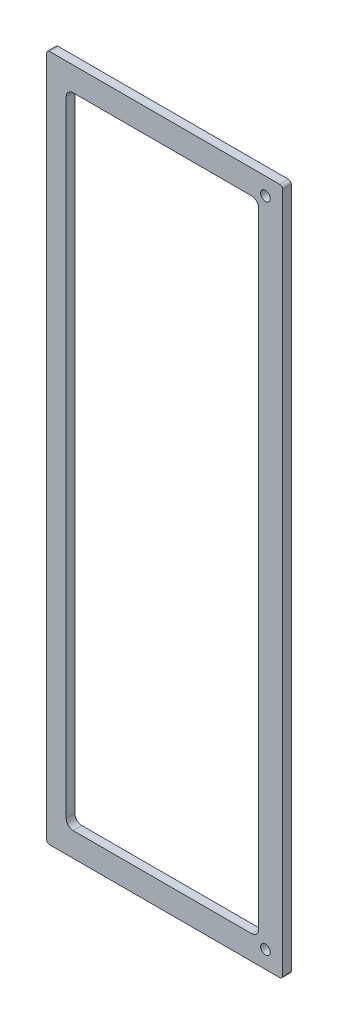
ISO-10303-21;
HEADER;
FILE_DESCRIPTION(('STEP AP214'),'2;1');
FILE_NAME('part.step','',(''),(''),'','','');
FILE_SCHEMA(('AUTOMOTIVE_DESIGN { 1 0 10303 214 1 1 1 1 }'));
ENDSEC;
DATA;
#1=APPLICATION_CONTEXT('core data for automotive mechanical design processes');
#2=APPLICATION_PROTOCOL_DEFINITION('international standard','automotive_design',2000,#1);
#3=PRODUCT_CONTEXT('',#1,'mechanical');
#4=PRODUCT('Part','Part','',(#3));
#5=PRODUCT_RELATED_PRODUCT_CATEGORY('part','',(#4));
#6=PRODUCT_DEFINITION_FORMATION('','',#4);
#7=PRODUCT_DEFINITION_CONTEXT('part definition',#1,'design');
#8=PRODUCT_DEFINITION('design','',#6,#7);
#9=PRODUCT_DEFINITION_SHAPE('','',#8);
#10=(LENGTH_UNIT() NAMED_UNIT(*) SI_UNIT(.MILLI.,.METRE.));
#11=(NAMED_UNIT(*) PLANE_ANGLE_UNIT() SI_UNIT($,.RADIAN.));
#12=(NAMED_UNIT(*) SI_UNIT($,.STERADIAN.) SOLID_ANGLE_UNIT());
#13=UNCERTAINTY_MEASURE_WITH_UNIT(LENGTH_MEASURE(1.E-05),#10,'distance_accuracy_value','');
#14=(GEOMETRIC_REPRESENTATION_CONTEXT(3) GLOBAL_UNCERTAINTY_ASSIGNED_CONTEXT((#13)) GLOBAL_UNIT_ASSIGNED_CONTEXT((#10,
#11,#12)) REPRESENTATION_CONTEXT('',''));
#15=CARTESIAN_POINT('',(0.,0.,0.));
#16=DIRECTION('',(0.,0.,1.));
#17=DIRECTION('',(1.,0.,0.));
#18=AXIS2_PLACEMENT_3D('',#15,#16,#17);
#19=CARTESIAN_POINT('',(0.,-12.5,6.35));
#20=DIRECTION('',(0.,-1.,0.));
#21=DIRECTION('',(0.,0.,-1.));
#22=AXIS2_PLACEMENT_3D('',#19,#20,#21);
#23=PLANE('',#22);
#24=DIRECTION('',(-1.,0.,0.));
#25=VECTOR('',#24,1.);
#26=CARTESIAN_POINT('',(0.,-12.5,0.));
#27=LINE('',#26,#25);
#28=CARTESIAN_POINT('',(10.37,-12.5,0.));
#29=VERTEX_POINT('',#28);
#30=CARTESIAN_POINT('',(-157.12,-12.5,0.));
#31=VERTEX_POINT('',#30);
#32=EDGE_CURVE('E200',#29,#31,#27,.T.);
#33=ORIENTED_EDGE('',*,*,#32,.F.);
#34=DIRECTION('',(0.,0.,-1.));
#35=VECTOR('',#34,1.);
#36=CARTESIAN_POINT('',(10.37,-12.5,6.35));
#37=LINE('',#36,#35);
#38=CARTESIAN_POINT('',(10.37,-12.5,6.35));
#39=VERTEX_POINT('',#38);
#40=EDGE_CURVE('E245',#29,#39,#37,.F.);
#41=ORIENTED_EDGE('',*,*,#40,.T.);
#42=DIRECTION('',(-1.,0.,0.));
#43=VECTOR('',#42,1.);
#44=CARTESIAN_POINT('',(0.,-12.5,6.35));
#45=LINE('',#44,#43);
#46=CARTESIAN_POINT('',(-157.12,-12.5,6.35));
#47=VERTEX_POINT('',#46);
#48=EDGE_CURVE('E206',#39,#47,#45,.T.);
#49=ORIENTED_EDGE('',*,*,#48,.T.);
#50=DIRECTION('',(0.,0.,1.));
#51=VECTOR('',#50,1.);
#52=CARTESIAN_POINT('',(-157.12,-12.5,0.));
#53=LINE('',#52,#51);
#54=EDGE_CURVE('E242',#47,#31,#53,.F.);
#55=ORIENTED_EDGE('',*,*,#54,.T.);
#56=EDGE_LOOP('',(#33,#41,#49,#55));
#57=FACE_BOUND('',#56,.T.);
#58=ADVANCED_FACE('F46',(#57),#23,.T.);
#59=CARTESIAN_POINT('',(12.5,0.,6.35));
#60=DIRECTION('',(-1.,0.,0.));
#61=DIRECTION('',(0.,0.,1.));
#62=AXIS2_PLACEMENT_3D('',#59,#60,#61);
#63=PLANE('',#62);
#64=DIRECTION('',(0.,1.,0.));
#65=VECTOR('',#64,1.);
#66=CARTESIAN_POINT('',(12.5,0.,0.));
#67=LINE('',#66,#65);
#68=CARTESIAN_POINT('',(12.5,-10.37,0.));
#69=VERTEX_POINT('',#68);
#70=CARTESIAN_POINT('',(12.5,485.37,0.));
#71=VERTEX_POINT('',#70);
#72=EDGE_CURVE('E193',#69,#71,#67,.T.);
#73=ORIENTED_EDGE('',*,*,#72,.T.);
#74=DIRECTION('',(0.,0.,-1.));
#75=VECTOR('',#74,1.);
#76=CARTESIAN_POINT('',(12.5,485.37,6.35));
#77=LINE('',#76,#75);
#78=CARTESIAN_POINT('',(12.5,485.37,6.35));
#79=VERTEX_POINT('',#78);
#80=EDGE_CURVE('E165',#71,#79,#77,.F.);
#81=ORIENTED_EDGE('',*,*,#80,.T.);
#82=DIRECTION('',(0.,1.,0.));
#83=VECTOR('',#82,1.);
#84=CARTESIAN_POINT('',(12.5,0.,6.35));
#85=LINE('',#84,#83);
#86=CARTESIAN_POINT('',(12.5,-10.37,6.35));
#87=VERTEX_POINT('',#86);
#88=EDGE_CURVE('E342',#87,#79,#85,.T.);
#89=ORIENTED_EDGE('',*,*,#88,.F.);
#90=DIRECTION('',(0.,0.,-1.));
#91=VECTOR('',#90,1.);
#92=CARTESIAN_POINT('',(12.5,-10.37,0.));
#93=LINE('',#92,#91);
#94=EDGE_CURVE('E236',#87,#69,#93,.T.);
#95=ORIENTED_EDGE('',*,*,#94,.T.);
#96=EDGE_LOOP('',(#73,#81,#89,#95));
#97=FACE_BOUND('',#96,.T.);
#98=ADVANCED_FACE('F382',(#97),#63,.F.);
#99=CARTESIAN_POINT('',(0.,475.,6.35));
#100=DIRECTION('',(0.,0.,-1.));
#101=DIRECTION('',(-1.,0.,0.));
#102=AXIS2_PLACEMENT_3D('',#99,#100,#101);
#103=CYLINDRICAL_SURFACE('',#102,3.50000000000002);
#104=CARTESIAN_POINT('',(0.,475.,6.35));
#105=DIRECTION('',(0.,0.,1.));
#106=DIRECTION('',(1.,0.,0.));
#107=AXIS2_PLACEMENT_3D('',#104,#105,#106);
#108=CIRCLE('',#107,3.50000000000002);
#109=CARTESIAN_POINT('',(3.50000000000001,475.,6.35));
#110=VERTEX_POINT('',#109);
#111=EDGE_CURVE('E348',#110,#110,#108,.T.);
#112=ORIENTED_EDGE('',*,*,#111,.T.);
#113=EDGE_LOOP('',(#112));
#114=FACE_BOUND('',#113,.T.);
#115=CARTESIAN_POINT('',(0.,475.,0.));
#116=DIRECTION('',(0.,0.,1.));
#117=DIRECTION('',(1.,0.,0.));
#118=AXIS2_PLACEMENT_3D('',#115,#116,#117);
#119=CIRCLE('',#118,3.50000000000002);
#120=CARTESIAN_POINT('',(3.50000000000001,475.,0.));
#121=VERTEX_POINT('',#120);
#122=EDGE_CURVE('E192',#121,#121,#119,.T.);
#123=ORIENTED_EDGE('',*,*,#122,.F.);
#124=EDGE_LOOP('',(#123));
#125=FACE_BOUND('',#124,.T.);
#126=ADVANCED_FACE('F391',(#114,#125),#103,.F.);
#127=CARTESIAN_POINT('',(0.,487.5,6.35));
#128=DIRECTION('',(0.,-1.,0.));
#129=DIRECTION('',(0.,0.,-1.));
#130=AXIS2_PLACEMENT_3D('',#127,#128,#129);
#131=PLANE('',#130);
#132=DIRECTION('',(-1.,0.,0.));
#133=VECTOR('',#132,1.);
#134=CARTESIAN_POINT('',(0.,487.5,0.));
#135=LINE('',#134,#133);
#136=CARTESIAN_POINT('',(10.37,487.5,0.));
#137=VERTEX_POINT('',#136);
#138=CARTESIAN_POINT('',(-157.12,487.5,0.));
#139=VERTEX_POINT('',#138);
#140=EDGE_CURVE('E179',#137,#139,#135,.T.);
#141=ORIENTED_EDGE('',*,*,#140,.T.);
#142=DIRECTION('',(0.,0.,1.));
#143=VECTOR('',#142,1.);
#144=CARTESIAN_POINT('',(-157.12,487.5,6.35));
#145=LINE('',#144,#143);
#146=CARTESIAN_POINT('',(-157.12,487.5,6.35));
#147=VERTEX_POINT('',#146);
#148=EDGE_CURVE('E184',#139,#147,#145,.T.);
#149=ORIENTED_EDGE('',*,*,#148,.T.);
#150=DIRECTION('',(-1.,0.,0.));
#151=VECTOR('',#150,1.);
#152=CARTESIAN_POINT('',(0.,487.5,6.35));
#153=LINE('',#152,#151);
#154=CARTESIAN_POINT('',(10.37,487.5,6.35));
#155=VERTEX_POINT('',#154);
#156=EDGE_CURVE('E182',#155,#147,#153,.T.);
#157=ORIENTED_EDGE('',*,*,#156,.F.);
#158=DIRECTION('',(0.,0.,-1.));
#159=VECTOR('',#158,1.);
#160=CARTESIAN_POINT('',(10.37,487.5,6.35));
#161=LINE('',#160,#159);
#162=EDGE_CURVE('E164',#155,#137,#161,.T.);
#163=ORIENTED_EDGE('',*,*,#162,.T.);
#164=EDGE_LOOP('',(#141,#149,#157,#163));
#165=FACE_BOUND('',#164,.T.);
#166=ADVANCED_FACE('F177',(#165),#131,.F.);
#167=CARTESIAN_POINT('',(0.,0.,6.35));
#168=DIRECTION('',(0.,0.,-1.));
#169=DIRECTION('',(-1.,0.,0.));
#170=AXIS2_PLACEMENT_3D('',#167,#168,#169);
#171=CYLINDRICAL_SURFACE('',#170,3.5);
#172=CARTESIAN_POINT('',(0.,0.,6.35));
#173=DIRECTION('',(0.,0.,1.));
#174=DIRECTION('',(1.,0.,0.));
#175=AXIS2_PLACEMENT_3D('',#172,#173,#174);
#176=CIRCLE('',#175,3.5);
#177=CARTESIAN_POINT('',(3.5,0.,6.35));
#178=VERTEX_POINT('',#177);
#179=EDGE_CURVE('E185',#178,#178,#176,.T.);
#180=ORIENTED_EDGE('',*,*,#179,.T.);
#181=EDGE_LOOP('',(#180));
#182=FACE_BOUND('',#181,.T.);
#183=CARTESIAN_POINT('',(0.,0.,0.));
#184=DIRECTION('',(0.,0.,1.));
#185=DIRECTION('',(1.,0.,0.));
#186=AXIS2_PLACEMENT_3D('',#183,#184,#185);
#187=CIRCLE('',#186,3.5);
#188=CARTESIAN_POINT('',(3.5,0.,0.));
#189=VERTEX_POINT('',#188);
#190=EDGE_CURVE('E198',#189,#189,#187,.T.);
#191=ORIENTED_EDGE('',*,*,#190,.F.);
#192=EDGE_LOOP('',(#191));
#193=FACE_BOUND('',#192,.T.);
#194=ADVANCED_FACE('F444',(#182,#193),#171,.F.);
#195=CARTESIAN_POINT('',(0.,0.,6.35));
#196=DIRECTION('',(0.,0.,1.));
#197=DIRECTION('',(1.,0.,0.));
#198=AXIS2_PLACEMENT_3D('',#195,#196,#197);
#199=PLANE('',#198);
#200=ORIENTED_EDGE('',*,*,#156,.T.);
#201=CARTESIAN_POINT('',(-157.12,485.37,6.35));
#202=DIRECTION('',(0.,0.,1.));
#203=DIRECTION('',(1.,0.,0.));
#204=AXIS2_PLACEMENT_3D('',#201,#202,#203);
#205=CIRCLE('',#204,2.13);
#206=CARTESIAN_POINT('',(-159.25,485.37,6.35));
#207=VERTEX_POINT('',#206);
#208=EDGE_CURVE('E219',#147,#207,#205,.T.);
#209=ORIENTED_EDGE('',*,*,#208,.T.);
#210=DIRECTION('',(0.,1.,0.));
#211=VECTOR('',#210,1.);
#212=CARTESIAN_POINT('',(-159.25,487.5,6.35));
#213=LINE('',#212,#211);
#214=CARTESIAN_POINT('',(-159.25,-10.37,6.35));
#215=VERTEX_POINT('',#214);
#216=EDGE_CURVE('E369',#215,#207,#213,.T.);
#217=ORIENTED_EDGE('',*,*,#216,.F.);
#218=CARTESIAN_POINT('',(-157.12,-10.37,6.35));
#219=DIRECTION('',(0.,0.,1.));
#220=DIRECTION('',(1.,0.,0.));
#221=AXIS2_PLACEMENT_3D('',#218,#219,#220);
#222=CIRCLE('',#221,2.13);
#223=EDGE_CURVE('E210',#215,#47,#222,.T.);
#224=ORIENTED_EDGE('',*,*,#223,.T.);
#225=ORIENTED_EDGE('',*,*,#48,.F.);
#226=CARTESIAN_POINT('',(10.37,-10.37,6.35));
#227=DIRECTION('',(0.,0.,1.));
#228=DIRECTION('',(1.,0.,0.));
#229=AXIS2_PLACEMENT_3D('',#226,#227,#228);
#230=CIRCLE('',#229,2.13);
#231=EDGE_CURVE('E213',#39,#87,#230,.T.);
#232=ORIENTED_EDGE('',*,*,#231,.T.);
#233=ORIENTED_EDGE('',*,*,#88,.T.);
#234=CARTESIAN_POINT('',(10.37,485.37,6.35));
#235=DIRECTION('',(0.,0.,1.));
#236=DIRECTION('',(1.,0.,0.));
#237=AXIS2_PLACEMENT_3D('',#234,#235,#236);
#238=CIRCLE('',#237,2.13);
#239=EDGE_CURVE('E216',#79,#155,#238,.T.);
#240=ORIENTED_EDGE('',*,*,#239,.T.);
#241=EDGE_LOOP('',(#200,#209,#217,#224,#225,#232,#233,#240));
#242=FACE_BOUND('',#241,.T.);
#243=DIRECTION('',(0.,1.,0.));
#244=VECTOR('',#243,1.);
#245=CARTESIAN_POINT('',(-4.99999975971581,470.000000240284,6.35));
#246=LINE('',#245,#244);
#247=CARTESIAN_POINT('',(-4.99999975971581,9.99999975971583,6.35));
#248=VERTEX_POINT('',#247);
#249=CARTESIAN_POINT('',(-4.99999975971581,465.000000240284,6.35));
#250=VERTEX_POINT('',#249);
#251=EDGE_CURVE('E299',#248,#250,#246,.T.);
#252=ORIENTED_EDGE('',*,*,#251,.F.);
#253=CARTESIAN_POINT('',(-9.99999975971581,9.99999975971583,6.35));
#254=DIRECTION('',(0.,0.,1.));
#255=DIRECTION('',(1.,0.,0.));
#256=AXIS2_PLACEMENT_3D('',#253,#254,#255);
#257=CIRCLE('',#256,5.);
#258=CARTESIAN_POINT('',(-9.9999997597158,4.99999975971581,6.35));
#259=VERTEX_POINT('',#258);
#260=EDGE_CURVE('E275',#248,#259,#257,.F.);
#261=ORIENTED_EDGE('',*,*,#260,.T.);
#262=DIRECTION('',(1.,0.,0.));
#263=VECTOR('',#262,1.);
#264=CARTESIAN_POINT('',(-145.000000240284,4.99999975971581,6.35));
#265=LINE('',#264,#263);
#266=CARTESIAN_POINT('',(-140.000000240284,4.99999975971581,6.35));
#267=VERTEX_POINT('',#266);
#268=EDGE_CURVE('E323',#267,#259,#265,.T.);
#269=ORIENTED_EDGE('',*,*,#268,.F.);
#270=CARTESIAN_POINT('',(-140.000000240284,9.99999975971581,6.35));
#271=DIRECTION('',(0.,0.,1.));
#272=DIRECTION('',(1.,0.,0.));
#273=AXIS2_PLACEMENT_3D('',#270,#271,#272);
#274=CIRCLE('',#273,5.);
#275=CARTESIAN_POINT('',(-145.000000240284,9.99999975971583,6.35));
#276=VERTEX_POINT('',#275);
#277=EDGE_CURVE('E281',#267,#276,#274,.F.);
#278=ORIENTED_EDGE('',*,*,#277,.T.);
#279=DIRECTION('',(0.,-1.,0.));
#280=VECTOR('',#279,1.);
#281=CARTESIAN_POINT('',(-145.000000240284,470.000000240284,6.35));
#282=LINE('',#281,#280);
#283=CARTESIAN_POINT('',(-145.000000240284,465.000000240284,6.35));
#284=VERTEX_POINT('',#283);
#285=EDGE_CURVE('E332',#284,#276,#282,.T.);
#286=ORIENTED_EDGE('',*,*,#285,.F.);
#287=CARTESIAN_POINT('',(-140.000000240284,465.000000240284,6.35));
#288=DIRECTION('',(0.,0.,1.));
#289=DIRECTION('',(1.,0.,0.));
#290=AXIS2_PLACEMENT_3D('',#287,#288,#289);
#291=CIRCLE('',#290,5.);
#292=CARTESIAN_POINT('',(-140.000000240284,470.000000240284,6.35));
#293=VERTEX_POINT('',#292);
#294=EDGE_CURVE('E287',#284,#293,#291,.F.);
#295=ORIENTED_EDGE('',*,*,#294,.T.);
#296=DIRECTION('',(-1.,0.,0.));
#297=VECTOR('',#296,1.);
#298=CARTESIAN_POINT('',(-145.000000240284,470.000000240284,6.35));
#299=LINE('',#298,#297);
#300=CARTESIAN_POINT('',(-9.9999997597158,470.000000240284,6.35));
#301=VERTEX_POINT('',#300);
#302=EDGE_CURVE('E300',#301,#293,#299,.T.);
#303=ORIENTED_EDGE('',*,*,#302,.F.);
#304=CARTESIAN_POINT('',(-9.9999997597158,465.000000240284,6.35));
#305=DIRECTION('',(0.,0.,1.));
#306=DIRECTION('',(1.,0.,0.));
#307=AXIS2_PLACEMENT_3D('',#304,#305,#306);
#308=CIRCLE('',#307,5.);
#309=EDGE_CURVE('E55',#301,#250,#308,.F.);
#310=ORIENTED_EDGE('',*,*,#309,.T.);
#311=EDGE_LOOP('',(#252,#261,#269,#278,#286,#295,#303,#310));
#312=FACE_BOUND('',#311,.T.);
#313=ORIENTED_EDGE('',*,*,#111,.F.);
#314=EDGE_LOOP('',(#313));
#315=FACE_BOUND('',#314,.T.);
#316=ORIENTED_EDGE('',*,*,#179,.F.);
#317=EDGE_LOOP('',(#316));
#318=FACE_BOUND('',#317,.T.);
#319=ADVANCED_FACE('F297',(#242,#312,#315,#318),#199,.T.);
#320=CARTESIAN_POINT('',(0.,0.,0.));
#321=DIRECTION('',(0.,0.,1.));
#322=DIRECTION('',(1.,0.,0.));
#323=AXIS2_PLACEMENT_3D('',#320,#321,#322);
#324=PLANE('',#323);
#325=DIRECTION('',(0.,-1.,0.));
#326=VECTOR('',#325,1.);
#327=CARTESIAN_POINT('',(-145.000000240284,470.000000240284,0.));
#328=LINE('',#327,#326);
#329=CARTESIAN_POINT('',(-145.000000240284,465.000000240284,0.));
#330=VERTEX_POINT('',#329);
#331=CARTESIAN_POINT('',(-145.000000240284,9.99999975971583,0.));
#332=VERTEX_POINT('',#331);
#333=EDGE_CURVE('E315',#330,#332,#328,.T.);
#334=ORIENTED_EDGE('',*,*,#333,.T.);
#335=CARTESIAN_POINT('',(-140.000000240284,9.99999975971581,0.));
#336=DIRECTION('',(0.,0.,1.));
#337=DIRECTION('',(1.,0.,0.));
#338=AXIS2_PLACEMENT_3D('',#335,#336,#337);
#339=CIRCLE('',#338,5.);
#340=CARTESIAN_POINT('',(-140.000000240284,4.99999975971581,0.));
#341=VERTEX_POINT('',#340);
#342=EDGE_CURVE('E284',#332,#341,#339,.T.);
#343=ORIENTED_EDGE('',*,*,#342,.T.);
#344=DIRECTION('',(1.,0.,0.));
#345=VECTOR('',#344,1.);
#346=CARTESIAN_POINT('',(-145.000000240284,4.99999975971581,0.));
#347=LINE('',#346,#345);
#348=CARTESIAN_POINT('',(-9.9999997597158,4.99999975971581,0.));
#349=VERTEX_POINT('',#348);
#350=EDGE_CURVE('E321',#341,#349,#347,.T.);
#351=ORIENTED_EDGE('',*,*,#350,.T.);
#352=CARTESIAN_POINT('',(-9.99999975971581,9.99999975971583,0.));
#353=DIRECTION('',(0.,0.,1.));
#354=DIRECTION('',(1.,0.,0.));
#355=AXIS2_PLACEMENT_3D('',#352,#353,#354);
#356=CIRCLE('',#355,5.);
#357=CARTESIAN_POINT('',(-4.99999975971581,9.99999975971583,0.));
#358=VERTEX_POINT('',#357);
#359=EDGE_CURVE('E278',#349,#358,#356,.T.);
#360=ORIENTED_EDGE('',*,*,#359,.T.);
#361=DIRECTION('',(0.,1.,0.));
#362=VECTOR('',#361,1.);
#363=CARTESIAN_POINT('',(-4.99999975971581,470.000000240284,0.));
#364=LINE('',#363,#362);
#365=CARTESIAN_POINT('',(-4.99999975971581,465.000000240284,0.));
#366=VERTEX_POINT('',#365);
#367=EDGE_CURVE('E316',#358,#366,#364,.T.);
#368=ORIENTED_EDGE('',*,*,#367,.T.);
#369=CARTESIAN_POINT('',(-9.9999997597158,465.000000240284,0.));
#370=DIRECTION('',(0.,0.,1.));
#371=DIRECTION('',(1.,0.,0.));
#372=AXIS2_PLACEMENT_3D('',#369,#370,#371);
#373=CIRCLE('',#372,5.);
#374=CARTESIAN_POINT('',(-9.9999997597158,470.000000240284,0.));
#375=VERTEX_POINT('',#374);
#376=EDGE_CURVE('E11',#366,#375,#373,.T.);
#377=ORIENTED_EDGE('',*,*,#376,.T.);
#378=DIRECTION('',(-1.,0.,0.));
#379=VECTOR('',#378,1.);
#380=CARTESIAN_POINT('',(-145.000000240284,470.000000240284,0.));
#381=LINE('',#380,#379);
#382=CARTESIAN_POINT('',(-140.000000240284,470.000000240284,0.));
#383=VERTEX_POINT('',#382);
#384=EDGE_CURVE('E312',#375,#383,#381,.T.);
#385=ORIENTED_EDGE('',*,*,#384,.T.);
#386=CARTESIAN_POINT('',(-140.000000240284,465.000000240284,0.));
#387=DIRECTION('',(0.,0.,1.));
#388=DIRECTION('',(1.,0.,0.));
#389=AXIS2_PLACEMENT_3D('',#386,#387,#388);
#390=CIRCLE('',#389,5.);
#391=EDGE_CURVE('E290',#383,#330,#390,.T.);
#392=ORIENTED_EDGE('',*,*,#391,.T.);
#393=EDGE_LOOP('',(#334,#343,#351,#360,#368,#377,#385,#392));
#394=FACE_BOUND('',#393,.T.);
#395=DIRECTION('',(0.,1.,0.));
#396=VECTOR('',#395,1.);
#397=CARTESIAN_POINT('',(-159.25,487.5,0.));
#398=LINE('',#397,#396);
#399=CARTESIAN_POINT('',(-159.25,-10.37,0.));
#400=VERTEX_POINT('',#399);
#401=CARTESIAN_POINT('',(-159.25,485.37,0.));
#402=VERTEX_POINT('',#401);
#403=EDGE_CURVE('E309',#400,#402,#398,.T.);
#404=ORIENTED_EDGE('',*,*,#403,.T.);
#405=CARTESIAN_POINT('',(-157.12,485.37,0.));
#406=DIRECTION('',(0.,0.,1.));
#407=DIRECTION('',(1.,0.,0.));
#408=AXIS2_PLACEMENT_3D('',#405,#406,#407);
#409=CIRCLE('',#408,2.13);
#410=EDGE_CURVE('E171',#402,#139,#409,.F.);
#411=ORIENTED_EDGE('',*,*,#410,.T.);
#412=ORIENTED_EDGE('',*,*,#140,.F.);
#413=CARTESIAN_POINT('',(10.37,485.37,0.));
#414=DIRECTION('',(0.,0.,1.));
#415=DIRECTION('',(1.,0.,0.));
#416=AXIS2_PLACEMENT_3D('',#413,#414,#415);
#417=CIRCLE('',#416,2.13);
#418=EDGE_CURVE('E160',#137,#71,#417,.F.);
#419=ORIENTED_EDGE('',*,*,#418,.T.);
#420=ORIENTED_EDGE('',*,*,#72,.F.);
#421=CARTESIAN_POINT('',(10.37,-10.37,0.));
#422=DIRECTION('',(0.,0.,1.));
#423=DIRECTION('',(1.,0.,0.));
#424=AXIS2_PLACEMENT_3D('',#421,#422,#423);
#425=CIRCLE('',#424,2.13);
#426=EDGE_CURVE('E172',#69,#29,#425,.F.);
#427=ORIENTED_EDGE('',*,*,#426,.T.);
#428=ORIENTED_EDGE('',*,*,#32,.T.);
#429=CARTESIAN_POINT('',(-157.12,-10.37,0.));
#430=DIRECTION('',(0.,0.,1.));
#431=DIRECTION('',(1.,0.,0.));
#432=AXIS2_PLACEMENT_3D('',#429,#430,#431);
#433=CIRCLE('',#432,2.13);
#434=EDGE_CURVE('E229',#31,#400,#433,.F.);
#435=ORIENTED_EDGE('',*,*,#434,.T.);
#436=EDGE_LOOP('',(#404,#411,#412,#419,#420,#427,#428,#435));
#437=FACE_BOUND('',#436,.T.);
#438=ORIENTED_EDGE('',*,*,#122,.T.);
#439=EDGE_LOOP('',(#438));
#440=FACE_BOUND('',#439,.T.);
#441=ORIENTED_EDGE('',*,*,#190,.T.);
#442=EDGE_LOOP('',(#441));
#443=FACE_BOUND('',#442,.T.);
#444=ADVANCED_FACE('F188',(#394,#437,#440,#443),#324,.F.);
#445=CARTESIAN_POINT('',(-4.99999975971581,470.000000240284,0.));
#446=DIRECTION('',(1.,0.,0.));
#447=DIRECTION('',(0.,0.,-1.));
#448=AXIS2_PLACEMENT_3D('',#445,#446,#447);
#449=PLANE('',#448);
#450=ORIENTED_EDGE('',*,*,#367,.F.);
#451=DIRECTION('',(0.,0.,1.));
#452=VECTOR('',#451,1.);
#453=CARTESIAN_POINT('',(-4.99999975971581,9.99999975971583,6.35));
#454=LINE('',#453,#452);
#455=EDGE_CURVE('E251',#358,#248,#454,.T.);
#456=ORIENTED_EDGE('',*,*,#455,.T.);
#457=ORIENTED_EDGE('',*,*,#251,.T.);
#458=DIRECTION('',(0.,0.,1.));
#459=VECTOR('',#458,1.);
#460=CARTESIAN_POINT('',(-4.99999975971581,465.000000240284,0.));
#461=LINE('',#460,#459);
#462=EDGE_CURVE('E248',#250,#366,#461,.F.);
#463=ORIENTED_EDGE('',*,*,#462,.T.);
#464=EDGE_LOOP('',(#450,#456,#457,#463));
#465=FACE_BOUND('',#464,.T.);
#466=ADVANCED_FACE('F306',(#465),#449,.F.);
#467=CARTESIAN_POINT('',(-145.000000240284,4.99999975971581,0.));
#468=DIRECTION('',(0.,-1.,0.));
#469=DIRECTION('',(0.,0.,-1.));
#470=AXIS2_PLACEMENT_3D('',#467,#468,#469);
#471=PLANE('',#470);
#472=ORIENTED_EDGE('',*,*,#268,.T.);
#473=DIRECTION('',(0.,0.,1.));
#474=VECTOR('',#473,1.);
#475=CARTESIAN_POINT('',(-9.99999975971581,4.99999975971581,0.));
#476=LINE('',#475,#474);
#477=EDGE_CURVE('E259',#259,#349,#476,.F.);
#478=ORIENTED_EDGE('',*,*,#477,.T.);
#479=ORIENTED_EDGE('',*,*,#350,.F.);
#480=DIRECTION('',(0.,0.,1.));
#481=VECTOR('',#480,1.);
#482=CARTESIAN_POINT('',(-140.000000240284,4.99999975971581,6.35));
#483=LINE('',#482,#481);
#484=EDGE_CURVE('E255',#341,#267,#483,.T.);
#485=ORIENTED_EDGE('',*,*,#484,.T.);
#486=EDGE_LOOP('',(#472,#478,#479,#485));
#487=FACE_BOUND('',#486,.T.);
#488=ADVANCED_FACE('F427',(#487),#471,.F.);
#489=CARTESIAN_POINT('',(-145.000000240284,470.000000240284,0.));
#490=DIRECTION('',(-1.,0.,0.));
#491=DIRECTION('',(0.,0.,1.));
#492=AXIS2_PLACEMENT_3D('',#489,#490,#491);
#493=PLANE('',#492);
#494=ORIENTED_EDGE('',*,*,#285,.T.);
#495=DIRECTION('',(0.,0.,1.));
#496=VECTOR('',#495,1.);
#497=CARTESIAN_POINT('',(-145.000000240284,9.99999975971581,0.));
#498=LINE('',#497,#496);
#499=EDGE_CURVE('E266',#276,#332,#498,.F.);
#500=ORIENTED_EDGE('',*,*,#499,.T.);
#501=ORIENTED_EDGE('',*,*,#333,.F.);
#502=DIRECTION('',(0.,0.,1.));
#503=VECTOR('',#502,1.);
#504=CARTESIAN_POINT('',(-145.000000240284,465.000000240284,6.35));
#505=LINE('',#504,#503);
#506=EDGE_CURVE('E262',#330,#284,#505,.T.);
#507=ORIENTED_EDGE('',*,*,#506,.T.);
#508=EDGE_LOOP('',(#494,#500,#501,#507));
#509=FACE_BOUND('',#508,.T.);
#510=ADVANCED_FACE('F420',(#509),#493,.F.);
#511=CARTESIAN_POINT('',(-145.000000240284,470.000000240284,0.));
#512=DIRECTION('',(0.,1.,0.));
#513=DIRECTION('',(0.,0.,1.));
#514=AXIS2_PLACEMENT_3D('',#511,#512,#513);
#515=PLANE('',#514);
#516=ORIENTED_EDGE('',*,*,#302,.T.);
#517=DIRECTION('',(0.,0.,1.));
#518=VECTOR('',#517,1.);
#519=CARTESIAN_POINT('',(-140.000000240284,470.000000240284,0.));
#520=LINE('',#519,#518);
#521=EDGE_CURVE('E62',#293,#383,#520,.F.);
#522=ORIENTED_EDGE('',*,*,#521,.T.);
#523=ORIENTED_EDGE('',*,*,#384,.F.);
#524=DIRECTION('',(0.,0.,1.));
#525=VECTOR('',#524,1.);
#526=CARTESIAN_POINT('',(-9.9999997597158,470.000000240284,6.35));
#527=LINE('',#526,#525);
#528=EDGE_CURVE('E269',#375,#301,#527,.T.);
#529=ORIENTED_EDGE('',*,*,#528,.T.);
#530=EDGE_LOOP('',(#516,#522,#523,#529));
#531=FACE_BOUND('',#530,.T.);
#532=ADVANCED_FACE('F311',(#531),#515,.F.);
#533=CARTESIAN_POINT('',(-159.25,487.5,0.));
#534=DIRECTION('',(1.,0.,0.));
#535=DIRECTION('',(0.,1.,0.));
#536=AXIS2_PLACEMENT_3D('',#533,#534,#535);
#537=PLANE('',#536);
#538=ORIENTED_EDGE('',*,*,#216,.T.);
#539=DIRECTION('',(0.,0.,1.));
#540=VECTOR('',#539,1.);
#541=CARTESIAN_POINT('',(-159.25,485.37,0.));
#542=LINE('',#541,#540);
#543=EDGE_CURVE('E226',#207,#402,#542,.F.);
#544=ORIENTED_EDGE('',*,*,#543,.T.);
#545=ORIENTED_EDGE('',*,*,#403,.F.);
#546=DIRECTION('',(0.,0.,1.));
#547=VECTOR('',#546,1.);
#548=CARTESIAN_POINT('',(-159.25,-10.37,6.35));
#549=LINE('',#548,#547);
#550=EDGE_CURVE('E222',#400,#215,#549,.T.);
#551=ORIENTED_EDGE('',*,*,#550,.T.);
#552=EDGE_LOOP('',(#538,#544,#545,#551));
#553=FACE_BOUND('',#552,.T.);
#554=ADVANCED_FACE('F368',(#553),#537,.F.);
#555=CARTESIAN_POINT('',(-157.12,485.37,6.35));
#556=DIRECTION('',(0.,0.,1.));
#557=DIRECTION('',(1.,0.,0.));
#558=AXIS2_PLACEMENT_3D('',#555,#556,#557);
#559=CYLINDRICAL_SURFACE('',#558,2.13);
#560=ORIENTED_EDGE('',*,*,#410,.F.);
#561=ORIENTED_EDGE('',*,*,#543,.F.);
#562=ORIENTED_EDGE('',*,*,#208,.F.);
#563=ORIENTED_EDGE('',*,*,#148,.F.);
#564=EDGE_LOOP('',(#560,#561,#562,#563));
#565=FACE_BOUND('',#564,.T.);
#566=ADVANCED_FACE('F377',(#565),#559,.T.);
#567=CARTESIAN_POINT('',(10.37,485.37,6.35));
#568=DIRECTION('',(0.,0.,-1.));
#569=DIRECTION('',(-1.,0.,0.));
#570=AXIS2_PLACEMENT_3D('',#567,#568,#569);
#571=CYLINDRICAL_SURFACE('',#570,2.13);
#572=ORIENTED_EDGE('',*,*,#239,.F.);
#573=ORIENTED_EDGE('',*,*,#80,.F.);
#574=ORIENTED_EDGE('',*,*,#418,.F.);
#575=ORIENTED_EDGE('',*,*,#162,.F.);
#576=EDGE_LOOP('',(#572,#573,#574,#575));
#577=FACE_BOUND('',#576,.T.);
#578=ADVANCED_FACE('F163',(#577),#571,.T.);
#579=CARTESIAN_POINT('',(10.37,-10.37,6.35));
#580=DIRECTION('',(0.,0.,1.));
#581=DIRECTION('',(1.,0.,0.));
#582=AXIS2_PLACEMENT_3D('',#579,#580,#581);
#583=CYLINDRICAL_SURFACE('',#582,2.13);
#584=ORIENTED_EDGE('',*,*,#231,.F.);
#585=ORIENTED_EDGE('',*,*,#40,.F.);
#586=ORIENTED_EDGE('',*,*,#426,.F.);
#587=ORIENTED_EDGE('',*,*,#94,.F.);
#588=EDGE_LOOP('',(#584,#585,#586,#587));
#589=FACE_BOUND('',#588,.T.);
#590=ADVANCED_FACE('F384',(#589),#583,.T.);
#591=CARTESIAN_POINT('',(-157.12,-10.37,0.));
#592=DIRECTION('',(0.,0.,-1.));
#593=DIRECTION('',(-1.,0.,0.));
#594=AXIS2_PLACEMENT_3D('',#591,#592,#593);
#595=CYLINDRICAL_SURFACE('',#594,2.13);
#596=ORIENTED_EDGE('',*,*,#434,.F.);
#597=ORIENTED_EDGE('',*,*,#54,.F.);
#598=ORIENTED_EDGE('',*,*,#223,.F.);
#599=ORIENTED_EDGE('',*,*,#550,.F.);
#600=EDGE_LOOP('',(#596,#597,#598,#599));
#601=FACE_BOUND('',#600,.T.);
#602=ADVANCED_FACE('F364',(#601),#595,.T.);
#603=CARTESIAN_POINT('',(-9.99999975971581,9.99999975971583,0.));
#604=DIRECTION('',(0.,0.,-1.));
#605=DIRECTION('',(-1.,0.,0.));
#606=AXIS2_PLACEMENT_3D('',#603,#604,#605);
#607=CYLINDRICAL_SURFACE('',#606,5.);
#608=ORIENTED_EDGE('',*,*,#359,.F.);
#609=ORIENTED_EDGE('',*,*,#477,.F.);
#610=ORIENTED_EDGE('',*,*,#260,.F.);
#611=ORIENTED_EDGE('',*,*,#455,.F.);
#612=EDGE_LOOP('',(#608,#609,#610,#611));
#613=FACE_BOUND('',#612,.T.);
#614=ADVANCED_FACE('F403',(#613),#607,.F.);
#615=CARTESIAN_POINT('',(-140.000000240284,9.99999975971581,0.));
#616=DIRECTION('',(0.,0.,-1.));
#617=DIRECTION('',(-1.,0.,0.));
#618=AXIS2_PLACEMENT_3D('',#615,#616,#617);
#619=CYLINDRICAL_SURFACE('',#618,5.);
#620=ORIENTED_EDGE('',*,*,#342,.F.);
#621=ORIENTED_EDGE('',*,*,#499,.F.);
#622=ORIENTED_EDGE('',*,*,#277,.F.);
#623=ORIENTED_EDGE('',*,*,#484,.F.);
#624=EDGE_LOOP('',(#620,#621,#622,#623));
#625=FACE_BOUND('',#624,.T.);
#626=ADVANCED_FACE('F406',(#625),#619,.F.);
#627=CARTESIAN_POINT('',(-140.000000240284,465.000000240284,0.));
#628=DIRECTION('',(0.,0.,-1.));
#629=DIRECTION('',(-1.,0.,0.));
#630=AXIS2_PLACEMENT_3D('',#627,#628,#629);
#631=CYLINDRICAL_SURFACE('',#630,5.);
#632=ORIENTED_EDGE('',*,*,#391,.F.);
#633=ORIENTED_EDGE('',*,*,#521,.F.);
#634=ORIENTED_EDGE('',*,*,#294,.F.);
#635=ORIENTED_EDGE('',*,*,#506,.F.);
#636=EDGE_LOOP('',(#632,#633,#634,#635));
#637=FACE_BOUND('',#636,.T.);
#638=ADVANCED_FACE('F409',(#637),#631,.F.);
#639=CARTESIAN_POINT('',(-9.9999997597158,465.000000240284,0.));
#640=DIRECTION('',(0.,0.,-1.));
#641=DIRECTION('',(-1.,0.,0.));
#642=AXIS2_PLACEMENT_3D('',#639,#640,#641);
#643=CYLINDRICAL_SURFACE('',#642,5.);
#644=ORIENTED_EDGE('',*,*,#376,.F.);
#645=ORIENTED_EDGE('',*,*,#462,.F.);
#646=ORIENTED_EDGE('',*,*,#309,.F.);
#647=ORIENTED_EDGE('',*,*,#528,.F.);
#648=EDGE_LOOP('',(#644,#645,#646,#647));
#649=FACE_BOUND('',#648,.T.);
#650=ADVANCED_FACE('F48',(#649),#643,.F.);
#651=CLOSED_SHELL('',(#58,#98,#126,#166,#194,#319,#444,#466,#488,#510,#532,#554,#566,#578,#590,
#602,#614,#626,#638,#650));
#652=MANIFOLD_SOLID_BREP('B2',#651);
#653=ADVANCED_BREP_SHAPE_REPRESENTATION('',(#18,#652),#14);
#654=SHAPE_DEFINITION_REPRESENTATION(#9,#653);
ENDSEC;
END-ISO-10303-21;
